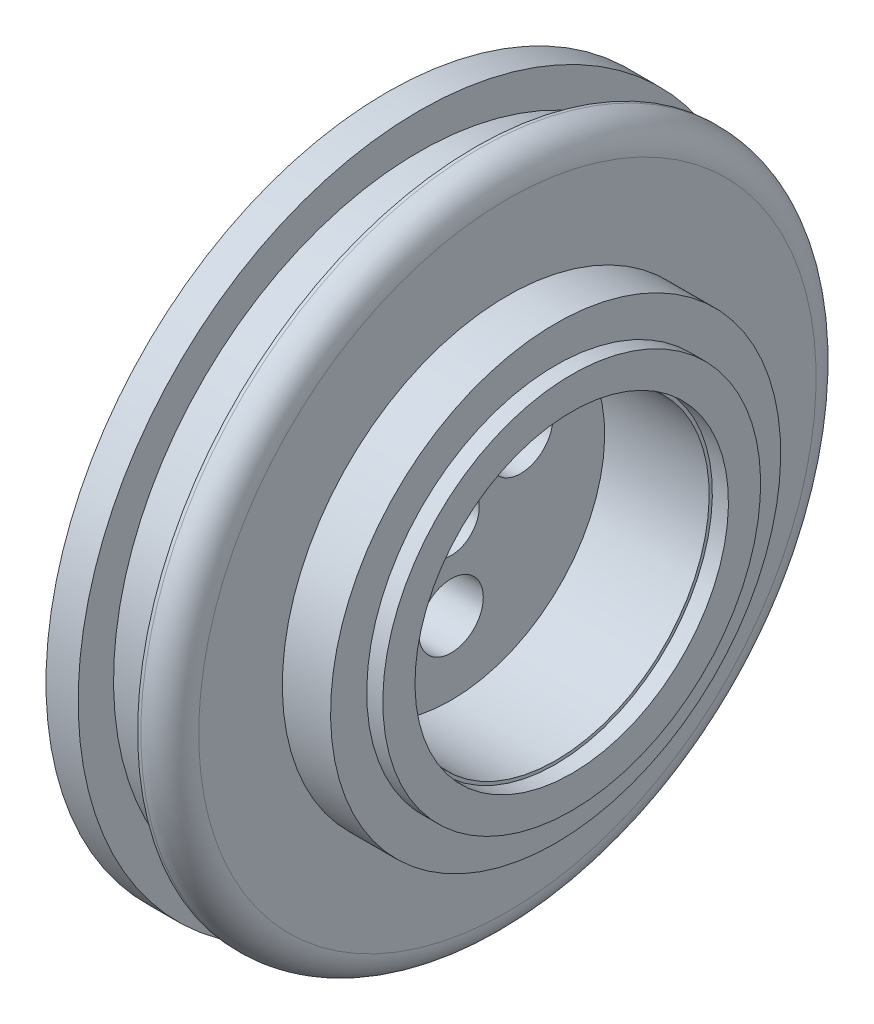
ISO-10303-21;
HEADER;
FILE_DESCRIPTION(('STEP AP214'),'2;1');
FILE_NAME('part.step','',(''),(''),'','','');
FILE_SCHEMA(('AUTOMOTIVE_DESIGN { 1 0 10303 214 1 1 1 1 }'));
ENDSEC;
DATA;
#1=APPLICATION_CONTEXT('core data for automotive mechanical design processes');
#2=APPLICATION_PROTOCOL_DEFINITION('international standard','automotive_design',2000,#1);
#3=PRODUCT_CONTEXT('',#1,'mechanical');
#4=PRODUCT('Part','Part','',(#3));
#5=PRODUCT_RELATED_PRODUCT_CATEGORY('part','',(#4));
#6=PRODUCT_DEFINITION_FORMATION('','',#4);
#7=PRODUCT_DEFINITION_CONTEXT('part definition',#1,'design');
#8=PRODUCT_DEFINITION('design','',#6,#7);
#9=PRODUCT_DEFINITION_SHAPE('','',#8);
#10=(LENGTH_UNIT() NAMED_UNIT(*) SI_UNIT(.MILLI.,.METRE.));
#11=(NAMED_UNIT(*) PLANE_ANGLE_UNIT() SI_UNIT($,.RADIAN.));
#12=(NAMED_UNIT(*) SI_UNIT($,.STERADIAN.) SOLID_ANGLE_UNIT());
#13=UNCERTAINTY_MEASURE_WITH_UNIT(LENGTH_MEASURE(1.E-05),#10,'distance_accuracy_value','');
#14=(GEOMETRIC_REPRESENTATION_CONTEXT(3) GLOBAL_UNCERTAINTY_ASSIGNED_CONTEXT((#13)) GLOBAL_UNIT_ASSIGNED_CONTEXT((#10,
#11,#12)) REPRESENTATION_CONTEXT('',''));
#15=CARTESIAN_POINT('',(0.,0.,0.));
#16=DIRECTION('',(0.,0.,1.));
#17=DIRECTION('',(1.,0.,0.));
#18=AXIS2_PLACEMENT_3D('',#15,#16,#17);
#19=CARTESIAN_POINT('',(4.00000000000001,9.55000000000001,0.));
#20=DIRECTION('',(-1.,0.,0.));
#21=DIRECTION('',(0.,-1.,0.));
#22=AXIS2_PLACEMENT_3D('',#19,#20,#21);
#23=PLANE('',#22);
#24=CARTESIAN_POINT('',(4.00000000000001,2.49999999999996,-4.33012701892222));
#25=DIRECTION('',(-1.,0.,0.));
#26=DIRECTION('',(0.,-1.,0.));
#27=AXIS2_PLACEMENT_3D('',#24,#25,#26);
#28=CIRCLE('',#27,2.);
#29=CARTESIAN_POINT('',(4.00000000000001,2.49999999999996,-6.33012701892222));
#30=VERTEX_POINT('',#29);
#31=EDGE_CURVE('E72',#30,#30,#28,.T.);
#32=ORIENTED_EDGE('',*,*,#31,.T.);
#33=EDGE_LOOP('',(#32));
#34=FACE_BOUND('',#33,.T.);
#35=CARTESIAN_POINT('',(4.00000000000001,2.50000000000002,4.33012701892218));
#36=DIRECTION('',(-1.,0.,0.));
#37=DIRECTION('',(0.,-1.,0.));
#38=AXIS2_PLACEMENT_3D('',#35,#36,#37);
#39=CIRCLE('',#38,2.);
#40=CARTESIAN_POINT('',(4.00000000000001,2.50000000000002,2.33012701892218));
#41=VERTEX_POINT('',#40);
#42=EDGE_CURVE('E61',#41,#41,#39,.T.);
#43=ORIENTED_EDGE('',*,*,#42,.T.);
#44=EDGE_LOOP('',(#43));
#45=FACE_BOUND('',#44,.T.);
#46=CARTESIAN_POINT('',(4.00000000000001,-5.,0.));
#47=DIRECTION('',(-1.,0.,0.));
#48=DIRECTION('',(0.,-1.,0.));
#49=AXIS2_PLACEMENT_3D('',#46,#47,#48);
#50=CIRCLE('',#49,2.);
#51=CARTESIAN_POINT('',(4.00000000000001,-5.,-2.));
#52=VERTEX_POINT('',#51);
#53=EDGE_CURVE('E58',#52,#52,#50,.T.);
#54=ORIENTED_EDGE('',*,*,#53,.T.);
#55=EDGE_LOOP('',(#54));
#56=FACE_BOUND('',#55,.T.);
#57=CARTESIAN_POINT('',(4.00000000000001,0.,0.));
#58=DIRECTION('',(-1.,0.,0.));
#59=DIRECTION('',(0.,-1.,0.));
#60=AXIS2_PLACEMENT_3D('',#57,#58,#59);
#61=CIRCLE('',#60,1.75);
#62=CARTESIAN_POINT('',(4.00000000000001,0.,-1.75));
#63=VERTEX_POINT('',#62);
#64=EDGE_CURVE('E55',#63,#63,#61,.T.);
#65=ORIENTED_EDGE('',*,*,#64,.T.);
#66=EDGE_LOOP('',(#65));
#67=FACE_BOUND('',#66,.T.);
#68=CARTESIAN_POINT('',(4.00000000000001,0.,0.));
#69=DIRECTION('',(-1.,0.,0.));
#70=DIRECTION('',(0.,-1.,0.));
#71=AXIS2_PLACEMENT_3D('',#68,#69,#70);
#72=CIRCLE('',#71,9.55000000000001);
#73=CARTESIAN_POINT('',(4.00000000000001,-9.55000000000001,0.));
#74=VERTEX_POINT('',#73);
#75=EDGE_CURVE('E10',#74,#74,#72,.T.);
#76=ORIENTED_EDGE('',*,*,#75,.F.);
#77=EDGE_LOOP('',(#76));
#78=FACE_BOUND('',#77,.T.);
#79=ADVANCED_FACE('F36',(#34,#45,#56,#67,#78),#23,.F.);
#80=CARTESIAN_POINT('',(0.,0.,0.));
#81=DIRECTION('',(-1.,0.,0.));
#82=DIRECTION('',(0.,-1.,0.));
#83=AXIS2_PLACEMENT_3D('',#80,#81,#82);
#84=CYLINDRICAL_SURFACE('',#83,9.55000000000001);
#85=CARTESIAN_POINT('',(10.5,0.,0.));
#86=DIRECTION('',(-1.,0.,0.));
#87=DIRECTION('',(0.,-1.,0.));
#88=AXIS2_PLACEMENT_3D('',#85,#86,#87);
#89=CIRCLE('',#88,9.55000000000001);
#90=CARTESIAN_POINT('',(10.5,-9.55000000000001,0.));
#91=VERTEX_POINT('',#90);
#92=EDGE_CURVE('E43',#91,#91,#89,.T.);
#93=ORIENTED_EDGE('',*,*,#92,.F.);
#94=EDGE_LOOP('',(#93));
#95=FACE_BOUND('',#94,.T.);
#96=ORIENTED_EDGE('',*,*,#75,.T.);
#97=EDGE_LOOP('',(#96));
#98=FACE_BOUND('',#97,.T.);
#99=ADVANCED_FACE('F118',(#95,#98),#84,.F.);
#100=CARTESIAN_POINT('',(10.5,9.75000000000001,0.));
#101=DIRECTION('',(-1.,0.,0.));
#102=DIRECTION('',(0.,-1.,0.));
#103=AXIS2_PLACEMENT_3D('',#100,#101,#102);
#104=PLANE('',#103);
#105=CARTESIAN_POINT('',(10.5,0.,0.));
#106=DIRECTION('',(-1.,0.,0.));
#107=DIRECTION('',(0.,-1.,0.));
#108=AXIS2_PLACEMENT_3D('',#105,#106,#107);
#109=CIRCLE('',#108,9.75000000000001);
#110=CARTESIAN_POINT('',(10.5,-9.75000000000001,0.));
#111=VERTEX_POINT('',#110);
#112=EDGE_CURVE('E48',#111,#111,#109,.T.);
#113=ORIENTED_EDGE('',*,*,#112,.F.);
#114=EDGE_LOOP('',(#113));
#115=FACE_BOUND('',#114,.T.);
#116=ORIENTED_EDGE('',*,*,#92,.T.);
#117=EDGE_LOOP('',(#116));
#118=FACE_BOUND('',#117,.T.);
#119=ADVANCED_FACE('F115',(#115,#118),#104,.F.);
#120=CARTESIAN_POINT('',(0.,0.,0.));
#121=DIRECTION('',(-1.,0.,0.));
#122=DIRECTION('',(0.,-1.,0.));
#123=AXIS2_PLACEMENT_3D('',#120,#121,#122);
#124=CYLINDRICAL_SURFACE('',#123,9.75000000000001);
#125=CARTESIAN_POINT('',(11.5,0.,0.));
#126=DIRECTION('',(-1.,0.,0.));
#127=DIRECTION('',(0.,-1.,0.));
#128=AXIS2_PLACEMENT_3D('',#125,#126,#127);
#129=CIRCLE('',#128,9.75000000000001);
#130=CARTESIAN_POINT('',(11.5,-9.75000000000001,0.));
#131=VERTEX_POINT('',#130);
#132=EDGE_CURVE('E108',#131,#131,#129,.T.);
#133=ORIENTED_EDGE('',*,*,#132,.F.);
#134=EDGE_LOOP('',(#133));
#135=FACE_BOUND('',#134,.T.);
#136=ORIENTED_EDGE('',*,*,#112,.T.);
#137=EDGE_LOOP('',(#136));
#138=FACE_BOUND('',#137,.T.);
#139=ADVANCED_FACE('F113',(#135,#138),#124,.F.);
#140=CARTESIAN_POINT('',(11.5,11.75,0.));
#141=DIRECTION('',(-1.,0.,0.));
#142=DIRECTION('',(0.,-1.,0.));
#143=AXIS2_PLACEMENT_3D('',#140,#141,#142);
#144=PLANE('',#143);
#145=CARTESIAN_POINT('',(11.5,0.,0.));
#146=DIRECTION('',(-1.,0.,0.));
#147=DIRECTION('',(0.,-1.,0.));
#148=AXIS2_PLACEMENT_3D('',#145,#146,#147);
#149=CIRCLE('',#148,11.75);
#150=CARTESIAN_POINT('',(11.5,-11.75,0.));
#151=VERTEX_POINT('',#150);
#152=EDGE_CURVE('E105',#151,#151,#149,.T.);
#153=ORIENTED_EDGE('',*,*,#152,.F.);
#154=EDGE_LOOP('',(#153));
#155=FACE_BOUND('',#154,.T.);
#156=ORIENTED_EDGE('',*,*,#132,.T.);
#157=EDGE_LOOP('',(#156));
#158=FACE_BOUND('',#157,.T.);
#159=ADVANCED_FACE('F130',(#155,#158),#144,.F.);
#160=CARTESIAN_POINT('',(0.,0.,0.));
#161=DIRECTION('',(-1.,0.,0.));
#162=DIRECTION('',(0.,-1.,0.));
#163=AXIS2_PLACEMENT_3D('',#160,#161,#162);
#164=CYLINDRICAL_SURFACE('',#163,11.75);
#165=CARTESIAN_POINT('',(10.5,0.,0.));
#166=DIRECTION('',(-1.,0.,0.));
#167=DIRECTION('',(0.,-1.,0.));
#168=AXIS2_PLACEMENT_3D('',#165,#166,#167);
#169=CIRCLE('',#168,11.75);
#170=CARTESIAN_POINT('',(10.5,-11.75,0.));
#171=VERTEX_POINT('',#170);
#172=EDGE_CURVE('E102',#171,#171,#169,.T.);
#173=ORIENTED_EDGE('',*,*,#172,.F.);
#174=EDGE_LOOP('',(#173));
#175=FACE_BOUND('',#174,.T.);
#176=ORIENTED_EDGE('',*,*,#152,.T.);
#177=EDGE_LOOP('',(#176));
#178=FACE_BOUND('',#177,.T.);
#179=ADVANCED_FACE('F134',(#175,#178),#164,.T.);
#180=CARTESIAN_POINT('',(10.5,14.,0.));
#181=DIRECTION('',(-1.,0.,0.));
#182=DIRECTION('',(0.,-1.,0.));
#183=AXIS2_PLACEMENT_3D('',#180,#181,#182);
#184=PLANE('',#183);
#185=CARTESIAN_POINT('',(10.5,0.,0.));
#186=DIRECTION('',(-1.,0.,0.));
#187=DIRECTION('',(0.,-1.,0.));
#188=AXIS2_PLACEMENT_3D('',#185,#186,#187);
#189=CIRCLE('',#188,14.);
#190=CARTESIAN_POINT('',(10.5,-14.,0.));
#191=VERTEX_POINT('',#190);
#192=EDGE_CURVE('E99',#191,#191,#189,.T.);
#193=ORIENTED_EDGE('',*,*,#192,.F.);
#194=EDGE_LOOP('',(#193));
#195=FACE_BOUND('',#194,.T.);
#196=ORIENTED_EDGE('',*,*,#172,.T.);
#197=EDGE_LOOP('',(#196));
#198=FACE_BOUND('',#197,.T.);
#199=ADVANCED_FACE('F138',(#195,#198),#184,.F.);
#200=CARTESIAN_POINT('',(0.,0.,0.));
#201=DIRECTION('',(-1.,0.,0.));
#202=DIRECTION('',(0.,-1.,0.));
#203=AXIS2_PLACEMENT_3D('',#200,#201,#202);
#204=CYLINDRICAL_SURFACE('',#203,14.);
#205=CARTESIAN_POINT('',(7.5,0.,0.));
#206=DIRECTION('',(-1.,0.,0.));
#207=DIRECTION('',(0.,-1.,0.));
#208=AXIS2_PLACEMENT_3D('',#205,#206,#207);
#209=CIRCLE('',#208,14.);
#210=CARTESIAN_POINT('',(7.5,-14.,0.));
#211=VERTEX_POINT('',#210);
#212=EDGE_CURVE('E96',#211,#211,#209,.T.);
#213=ORIENTED_EDGE('',*,*,#212,.F.);
#214=EDGE_LOOP('',(#213));
#215=FACE_BOUND('',#214,.T.);
#216=ORIENTED_EDGE('',*,*,#192,.T.);
#217=EDGE_LOOP('',(#216));
#218=FACE_BOUND('',#217,.T.);
#219=ADVANCED_FACE('F142',(#215,#218),#204,.T.);
#220=CARTESIAN_POINT('',(7.5,14.,0.));
#221=DIRECTION('',(-1.,0.,0.));
#222=DIRECTION('',(0.,-1.,0.));
#223=AXIS2_PLACEMENT_3D('',#220,#221,#222);
#224=PLANE('',#223);
#225=CARTESIAN_POINT('',(7.49999999999999,0.,0.));
#226=DIRECTION('',(-1.,0.,0.));
#227=DIRECTION('',(0.,-1.,0.));
#228=AXIS2_PLACEMENT_3D('',#225,#226,#227);
#229=CIRCLE('',#228,19.2);
#230=CARTESIAN_POINT('',(7.49999999999999,-19.2,0.));
#231=VERTEX_POINT('',#230);
#232=EDGE_CURVE('E93',#231,#231,#229,.T.);
#233=ORIENTED_EDGE('',*,*,#232,.F.);
#234=EDGE_LOOP('',(#233));
#235=FACE_BOUND('',#234,.T.);
#236=ORIENTED_EDGE('',*,*,#212,.T.);
#237=EDGE_LOOP('',(#236));
#238=FACE_BOUND('',#237,.T.);
#239=ADVANCED_FACE('F146',(#235,#238),#224,.F.);
#240=CARTESIAN_POINT('',(5.69999999999999,0.,0.));
#241=DIRECTION('',(-1.,0.,0.));
#242=DIRECTION('',(0.,-1.,0.));
#243=AXIS2_PLACEMENT_3D('',#240,#241,#242);
#244=TOROIDAL_SURFACE('',#243,19.2,1.8);
#245=CARTESIAN_POINT('',(5.69999999999999,0.,0.));
#246=DIRECTION('',(-1.,0.,0.));
#247=DIRECTION('',(0.,-1.,0.));
#248=AXIS2_PLACEMENT_3D('',#245,#246,#247);
#249=CIRCLE('',#248,21.);
#250=CARTESIAN_POINT('',(5.69999999999999,-21.,0.));
#251=VERTEX_POINT('',#250);
#252=EDGE_CURVE('E90',#251,#251,#249,.T.);
#253=ORIENTED_EDGE('',*,*,#252,.F.);
#254=EDGE_LOOP('',(#253));
#255=FACE_BOUND('',#254,.T.);
#256=ORIENTED_EDGE('',*,*,#232,.T.);
#257=EDGE_LOOP('',(#256));
#258=FACE_BOUND('',#257,.T.);
#259=ADVANCED_FACE('F150',(#255,#258),#244,.T.);
#260=CARTESIAN_POINT('',(0.,0.,0.));
#261=DIRECTION('',(-1.,0.,0.));
#262=DIRECTION('',(0.,-1.,0.));
#263=AXIS2_PLACEMENT_3D('',#260,#261,#262);
#264=CYLINDRICAL_SURFACE('',#263,21.);
#265=CARTESIAN_POINT('',(5.49999999999999,0.,0.));
#266=DIRECTION('',(-1.,0.,0.));
#267=DIRECTION('',(0.,-1.,0.));
#268=AXIS2_PLACEMENT_3D('',#265,#266,#267);
#269=CIRCLE('',#268,21.);
#270=CARTESIAN_POINT('',(5.49999999999999,-21.,0.));
#271=VERTEX_POINT('',#270);
#272=EDGE_CURVE('E87',#271,#271,#269,.T.);
#273=ORIENTED_EDGE('',*,*,#272,.F.);
#274=EDGE_LOOP('',(#273));
#275=FACE_BOUND('',#274,.T.);
#276=ORIENTED_EDGE('',*,*,#252,.T.);
#277=EDGE_LOOP('',(#276));
#278=FACE_BOUND('',#277,.T.);
#279=ADVANCED_FACE('F154',(#275,#278),#264,.T.);
#280=CARTESIAN_POINT('',(5.49999999999999,21.,0.));
#281=DIRECTION('',(1.,0.,0.));
#282=DIRECTION('',(0.,1.,0.));
#283=AXIS2_PLACEMENT_3D('',#280,#281,#282);
#284=PLANE('',#283);
#285=CARTESIAN_POINT('',(5.49999999999999,0.,0.));
#286=DIRECTION('',(-1.,0.,0.));
#287=DIRECTION('',(0.,-1.,0.));
#288=AXIS2_PLACEMENT_3D('',#285,#286,#287);
#289=CIRCLE('',#288,19.);
#290=CARTESIAN_POINT('',(5.49999999999999,-19.,0.));
#291=VERTEX_POINT('',#290);
#292=EDGE_CURVE('E84',#291,#291,#289,.T.);
#293=ORIENTED_EDGE('',*,*,#292,.F.);
#294=EDGE_LOOP('',(#293));
#295=FACE_BOUND('',#294,.T.);
#296=ORIENTED_EDGE('',*,*,#272,.T.);
#297=EDGE_LOOP('',(#296));
#298=FACE_BOUND('',#297,.T.);
#299=ADVANCED_FACE('F158',(#295,#298),#284,.F.);
#300=CARTESIAN_POINT('',(0.,0.,0.));
#301=DIRECTION('',(-1.,0.,0.));
#302=DIRECTION('',(0.,-1.,0.));
#303=AXIS2_PLACEMENT_3D('',#300,#301,#302);
#304=CYLINDRICAL_SURFACE('',#303,19.);
#305=CARTESIAN_POINT('',(1.99999999999999,0.,0.));
#306=DIRECTION('',(-1.,0.,0.));
#307=DIRECTION('',(0.,-1.,0.));
#308=AXIS2_PLACEMENT_3D('',#305,#306,#307);
#309=CIRCLE('',#308,19.);
#310=CARTESIAN_POINT('',(1.99999999999999,-19.,0.));
#311=VERTEX_POINT('',#310);
#312=EDGE_CURVE('E81',#311,#311,#309,.T.);
#313=ORIENTED_EDGE('',*,*,#312,.F.);
#314=EDGE_LOOP('',(#313));
#315=FACE_BOUND('',#314,.T.);
#316=ORIENTED_EDGE('',*,*,#292,.T.);
#317=EDGE_LOOP('',(#316));
#318=FACE_BOUND('',#317,.T.);
#319=ADVANCED_FACE('F162',(#315,#318),#304,.T.);
#320=CARTESIAN_POINT('',(1.99999999999999,19.,0.));
#321=DIRECTION('',(-1.,0.,0.));
#322=DIRECTION('',(0.,-1.,0.));
#323=AXIS2_PLACEMENT_3D('',#320,#321,#322);
#324=PLANE('',#323);
#325=CARTESIAN_POINT('',(1.99999999999999,0.,0.));
#326=DIRECTION('',(-1.,0.,0.));
#327=DIRECTION('',(0.,-1.,0.));
#328=AXIS2_PLACEMENT_3D('',#325,#326,#327);
#329=CIRCLE('',#328,21.2);
#330=CARTESIAN_POINT('',(1.99999999999999,-21.2,0.));
#331=VERTEX_POINT('',#330);
#332=EDGE_CURVE('E78',#331,#331,#329,.T.);
#333=ORIENTED_EDGE('',*,*,#332,.F.);
#334=EDGE_LOOP('',(#333));
#335=FACE_BOUND('',#334,.T.);
#336=ORIENTED_EDGE('',*,*,#312,.T.);
#337=EDGE_LOOP('',(#336));
#338=FACE_BOUND('',#337,.T.);
#339=ADVANCED_FACE('F166',(#335,#338),#324,.F.);
#340=CARTESIAN_POINT('',(0.,0.,0.));
#341=DIRECTION('',(-1.,0.,0.));
#342=DIRECTION('',(0.,-1.,0.));
#343=AXIS2_PLACEMENT_3D('',#340,#341,#342);
#344=CYLINDRICAL_SURFACE('',#343,21.2);
#345=CARTESIAN_POINT('',(0.,0.,0.));
#346=DIRECTION('',(-1.,0.,0.));
#347=DIRECTION('',(0.,-1.,0.));
#348=AXIS2_PLACEMENT_3D('',#345,#346,#347);
#349=CIRCLE('',#348,21.2);
#350=CARTESIAN_POINT('',(0.,-21.2,0.));
#351=VERTEX_POINT('',#350);
#352=EDGE_CURVE('E75',#351,#351,#349,.T.);
#353=ORIENTED_EDGE('',*,*,#352,.F.);
#354=EDGE_LOOP('',(#353));
#355=FACE_BOUND('',#354,.T.);
#356=ORIENTED_EDGE('',*,*,#332,.T.);
#357=EDGE_LOOP('',(#356));
#358=FACE_BOUND('',#357,.T.);
#359=ADVANCED_FACE('F170',(#355,#358),#344,.T.);
#360=CARTESIAN_POINT('',(0.,21.2,0.));
#361=DIRECTION('',(1.,0.,0.));
#362=DIRECTION('',(0.,1.,0.));
#363=AXIS2_PLACEMENT_3D('',#360,#361,#362);
#364=PLANE('',#363);
#365=CARTESIAN_POINT('',(0.,2.49999999999996,-4.33012701892222));
#366=DIRECTION('',(1.,0.,0.));
#367=DIRECTION('',(0.,1.,0.));
#368=AXIS2_PLACEMENT_3D('',#365,#366,#367);
#369=CIRCLE('',#368,2.);
#370=CARTESIAN_POINT('',(0.,2.49999999999996,-6.33012701892222));
#371=VERTEX_POINT('',#370);
#372=EDGE_CURVE('E39',#371,#371,#369,.T.);
#373=ORIENTED_EDGE('',*,*,#372,.T.);
#374=EDGE_LOOP('',(#373));
#375=FACE_BOUND('',#374,.T.);
#376=CARTESIAN_POINT('',(0.,2.50000000000002,4.33012701892218));
#377=DIRECTION('',(1.,0.,0.));
#378=DIRECTION('',(0.,1.,0.));
#379=AXIS2_PLACEMENT_3D('',#376,#377,#378);
#380=CIRCLE('',#379,2.);
#381=CARTESIAN_POINT('',(0.,2.50000000000002,2.33012701892218));
#382=VERTEX_POINT('',#381);
#383=EDGE_CURVE('E59',#382,#382,#380,.T.);
#384=ORIENTED_EDGE('',*,*,#383,.T.);
#385=EDGE_LOOP('',(#384));
#386=FACE_BOUND('',#385,.T.);
#387=CARTESIAN_POINT('',(0.,-5.,0.));
#388=DIRECTION('',(1.,0.,0.));
#389=DIRECTION('',(0.,1.,0.));
#390=AXIS2_PLACEMENT_3D('',#387,#388,#389);
#391=CIRCLE('',#390,2.);
#392=CARTESIAN_POINT('',(0.,-5.,-2.));
#393=VERTEX_POINT('',#392);
#394=EDGE_CURVE('E56',#393,#393,#391,.T.);
#395=ORIENTED_EDGE('',*,*,#394,.T.);
#396=EDGE_LOOP('',(#395));
#397=FACE_BOUND('',#396,.T.);
#398=CARTESIAN_POINT('',(0.,0.,0.));
#399=DIRECTION('',(1.,0.,0.));
#400=DIRECTION('',(0.,1.,0.));
#401=AXIS2_PLACEMENT_3D('',#398,#399,#400);
#402=CIRCLE('',#401,1.75);
#403=CARTESIAN_POINT('',(0.,0.,-1.75));
#404=VERTEX_POINT('',#403);
#405=EDGE_CURVE('E52',#404,#404,#402,.T.);
#406=ORIENTED_EDGE('',*,*,#405,.T.);
#407=EDGE_LOOP('',(#406));
#408=FACE_BOUND('',#407,.T.);
#409=ORIENTED_EDGE('',*,*,#352,.T.);
#410=EDGE_LOOP('',(#409));
#411=FACE_BOUND('',#410,.T.);
#412=ADVANCED_FACE('F174',(#375,#386,#397,#408,#411),#364,.F.);
#413=CARTESIAN_POINT('',(-1.2E-05,0.,0.));
#414=DIRECTION('',(1.,0.,0.));
#415=DIRECTION('',(0.,0.,-1.));
#416=AXIS2_PLACEMENT_3D('',#413,#414,#415);
#417=CYLINDRICAL_SURFACE('',#416,1.75);
#418=CARTESIAN_POINT('',(0.,0.,-1.75));
#419=CARTESIAN_POINT('',(0.0416666666666615,0.,-1.75));
#420=CARTESIAN_POINT('',(0.0833333333333283,0.,-1.75));
#421=CARTESIAN_POINT('',(0.166666666666662,0.,-1.75));
#422=CARTESIAN_POINT('',(0.208333333333329,0.,-1.75));
#423=CARTESIAN_POINT('',(0.291666666666662,0.,-1.75));
#424=CARTESIAN_POINT('',(0.333333333333329,0.,-1.75));
#425=CARTESIAN_POINT('',(0.416666666666663,0.,-1.75));
#426=CARTESIAN_POINT('',(0.45833333333333,0.,-1.75));
#427=CARTESIAN_POINT('',(0.541666666666663,0.,-1.75));
#428=CARTESIAN_POINT('',(0.58333333333333,0.,-1.75));
#429=CARTESIAN_POINT('',(0.666666666666664,0.,-1.75));
#430=CARTESIAN_POINT('',(0.708333333333331,0.,-1.75));
#431=CARTESIAN_POINT('',(0.791666666666664,0.,-1.75));
#432=CARTESIAN_POINT('',(0.833333333333331,0.,-1.75));
#433=CARTESIAN_POINT('',(0.916666666666665,0.,-1.75));
#434=CARTESIAN_POINT('',(0.958333333333331,0.,-1.75));
#435=CARTESIAN_POINT('',(1.04166666666667,0.,-1.75));
#436=CARTESIAN_POINT('',(1.08333333333333,0.,-1.75));
#437=CARTESIAN_POINT('',(1.16666666666667,0.,-1.75));
#438=CARTESIAN_POINT('',(1.20833333333333,0.,-1.75));
#439=CARTESIAN_POINT('',(1.29166666666667,0.,-1.75));
#440=CARTESIAN_POINT('',(1.33333333333333,0.,-1.75));
#441=CARTESIAN_POINT('',(1.41666666666667,0.,-1.75));
#442=CARTESIAN_POINT('',(1.45833333333333,0.,-1.75));
#443=CARTESIAN_POINT('',(1.54166666666667,0.,-1.75));
#444=CARTESIAN_POINT('',(1.58333333333333,0.,-1.75));
#445=CARTESIAN_POINT('',(1.66666666666667,0.,-1.75));
#446=CARTESIAN_POINT('',(1.70833333333333,0.,-1.75));
#447=CARTESIAN_POINT('',(1.79166666666667,0.,-1.75));
#448=CARTESIAN_POINT('',(1.83333333333333,0.,-1.75));
#449=CARTESIAN_POINT('',(1.91666666666667,0.,-1.75));
#450=CARTESIAN_POINT('',(1.95833333333333,0.,-1.75));
#451=CARTESIAN_POINT('',(2.04166666666667,0.,-1.75));
#452=CARTESIAN_POINT('',(2.08333333333334,0.,-1.75));
#453=CARTESIAN_POINT('',(2.16666666666667,0.,-1.75));
#454=CARTESIAN_POINT('',(2.20833333333334,0.,-1.75));
#455=CARTESIAN_POINT('',(2.29166666666667,0.,-1.75));
#456=CARTESIAN_POINT('',(2.33333333333334,0.,-1.75));
#457=CARTESIAN_POINT('',(2.41666666666667,0.,-1.75));
#458=CARTESIAN_POINT('',(2.45833333333334,0.,-1.75));
#459=CARTESIAN_POINT('',(2.54166666666667,0.,-1.75));
#460=CARTESIAN_POINT('',(2.58333333333334,0.,-1.75));
#461=CARTESIAN_POINT('',(2.66666666666667,0.,-1.75));
#462=CARTESIAN_POINT('',(2.70833333333334,0.,-1.75));
#463=CARTESIAN_POINT('',(2.79166666666667,0.,-1.75));
#464=CARTESIAN_POINT('',(2.83333333333334,0.,-1.75));
#465=CARTESIAN_POINT('',(2.91666666666667,0.,-1.75));
#466=CARTESIAN_POINT('',(2.95833333333334,0.,-1.75));
#467=CARTESIAN_POINT('',(3.04166666666667,0.,-1.75));
#468=CARTESIAN_POINT('',(3.08333333333334,0.,-1.75));
#469=CARTESIAN_POINT('',(3.16666666666667,0.,-1.75));
#470=CARTESIAN_POINT('',(3.20833333333334,0.,-1.75));
#471=CARTESIAN_POINT('',(3.29166666666667,0.,-1.75));
#472=CARTESIAN_POINT('',(3.33333333333334,0.,-1.75));
#473=CARTESIAN_POINT('',(3.41666666666667,0.,-1.75));
#474=CARTESIAN_POINT('',(3.45833333333334,0.,-1.75));
#475=CARTESIAN_POINT('',(3.54166666666667,0.,-1.75));
#476=CARTESIAN_POINT('',(3.58333333333334,0.,-1.75));
#477=CARTESIAN_POINT('',(3.66666666666667,0.,-1.75));
#478=CARTESIAN_POINT('',(3.70833333333334,0.,-1.75));
#479=CARTESIAN_POINT('',(3.79166666666667,0.,-1.75));
#480=CARTESIAN_POINT('',(3.83333333333334,0.,-1.75));
#481=CARTESIAN_POINT('',(3.91666666666667,0.,-1.75));
#482=CARTESIAN_POINT('',(3.95833333333334,0.,-1.75));
#483=CARTESIAN_POINT('',(4.00000000000001,0.,-1.75));
#484=B_SPLINE_CURVE_WITH_KNOTS('',3,(#418,#419,#420,#421,#422,#423,#424,#425,#426,#427,#428,
#429,#430,#431,#432,#433,#434,#435,#436,#437,#438,#439,#440,#441,#442,#443,#444,#445,#446,#447,
#448,#449,#450,#451,#452,#453,#454,#455,#456,#457,#458,#459,#460,#461,#462,#463,#464,#465,#466,
#467,#468,#469,#470,#471,#472,#473,#474,#475,#476,#477,#478,#479,#480,#481,#482,#483),
.UNSPECIFIED.,.F.,.F.,(4,2,2,2,2,2,2,2,2,2,2,2,2,2,2,2,2,2,2,2,2,2,2,2,2,2,2,2,2,2,2,2,4),(0.,
0.125,0.250000000000001,0.375000000000001,0.500000000000002,0.625000000000002,0.750000000000003,
0.875000000000003,1.,1.125,1.25,1.375,1.50000000000001,1.62500000000001,1.75000000000001,
1.87500000000001,2.00000000000001,2.12500000000001,2.25000000000001,2.37500000000001,
2.50000000000001,2.62500000000001,2.75000000000001,2.87500000000001,3.00000000000001,
3.12500000000001,3.25000000000001,3.37500000000001,3.50000000000001,3.62500000000001,
3.75000000000001,3.87500000000001,4.00000000000001),.UNSPECIFIED.);
#485=EDGE_CURVE('BSEAM178',#404,#63,#484,.T.);
#486=ORIENTED_EDGE('',*,*,#405,.F.);
#487=ORIENTED_EDGE('',*,*,#64,.F.);
#488=ORIENTED_EDGE('',*,*,#485,.T.);
#489=ORIENTED_EDGE('',*,*,#485,.F.);
#490=EDGE_LOOP('',(#486,#488,#487,#489));
#491=FACE_BOUND('',#490,.T.);
#492=ADVANCED_FACE('F178',(#491),#417,.F.);
#493=CARTESIAN_POINT('',(-1.2E-05,-5.,0.));
#494=DIRECTION('',(1.,0.,0.));
#495=DIRECTION('',(0.,0.,-1.));
#496=AXIS2_PLACEMENT_3D('',#493,#494,#495);
#497=CYLINDRICAL_SURFACE('',#496,2.);
#498=CARTESIAN_POINT('',(0.,-5.,-2.));
#499=CARTESIAN_POINT('',(0.0416666666666615,-5.,-2.));
#500=CARTESIAN_POINT('',(0.0833333333333283,-5.,-2.));
#501=CARTESIAN_POINT('',(0.166666666666662,-5.,-2.));
#502=CARTESIAN_POINT('',(0.208333333333329,-5.,-2.));
#503=CARTESIAN_POINT('',(0.291666666666662,-5.,-2.));
#504=CARTESIAN_POINT('',(0.333333333333329,-5.,-2.));
#505=CARTESIAN_POINT('',(0.416666666666663,-5.,-2.));
#506=CARTESIAN_POINT('',(0.45833333333333,-5.,-2.));
#507=CARTESIAN_POINT('',(0.541666666666663,-5.,-2.));
#508=CARTESIAN_POINT('',(0.58333333333333,-5.,-2.));
#509=CARTESIAN_POINT('',(0.666666666666664,-5.,-2.));
#510=CARTESIAN_POINT('',(0.708333333333331,-5.,-2.));
#511=CARTESIAN_POINT('',(0.791666666666664,-5.,-2.));
#512=CARTESIAN_POINT('',(0.833333333333331,-5.,-2.));
#513=CARTESIAN_POINT('',(0.916666666666665,-5.,-2.));
#514=CARTESIAN_POINT('',(0.958333333333331,-5.,-2.));
#515=CARTESIAN_POINT('',(1.04166666666667,-5.,-2.));
#516=CARTESIAN_POINT('',(1.08333333333333,-5.,-2.));
#517=CARTESIAN_POINT('',(1.16666666666667,-5.,-2.));
#518=CARTESIAN_POINT('',(1.20833333333333,-5.,-2.));
#519=CARTESIAN_POINT('',(1.29166666666667,-5.,-2.));
#520=CARTESIAN_POINT('',(1.33333333333333,-5.,-2.));
#521=CARTESIAN_POINT('',(1.41666666666667,-5.,-2.));
#522=CARTESIAN_POINT('',(1.45833333333333,-5.,-2.));
#523=CARTESIAN_POINT('',(1.54166666666667,-5.,-2.));
#524=CARTESIAN_POINT('',(1.58333333333333,-5.,-2.));
#525=CARTESIAN_POINT('',(1.66666666666667,-5.,-2.));
#526=CARTESIAN_POINT('',(1.70833333333333,-5.,-2.));
#527=CARTESIAN_POINT('',(1.79166666666667,-5.,-2.));
#528=CARTESIAN_POINT('',(1.83333333333333,-5.,-2.));
#529=CARTESIAN_POINT('',(1.91666666666667,-5.,-2.));
#530=CARTESIAN_POINT('',(1.95833333333333,-5.,-2.));
#531=CARTESIAN_POINT('',(2.04166666666667,-5.,-2.));
#532=CARTESIAN_POINT('',(2.08333333333334,-5.,-2.));
#533=CARTESIAN_POINT('',(2.16666666666667,-5.,-2.));
#534=CARTESIAN_POINT('',(2.20833333333334,-5.,-2.));
#535=CARTESIAN_POINT('',(2.29166666666667,-5.,-2.));
#536=CARTESIAN_POINT('',(2.33333333333334,-5.,-2.));
#537=CARTESIAN_POINT('',(2.41666666666667,-5.,-2.));
#538=CARTESIAN_POINT('',(2.45833333333334,-5.,-2.));
#539=CARTESIAN_POINT('',(2.54166666666667,-5.,-2.));
#540=CARTESIAN_POINT('',(2.58333333333334,-5.,-2.));
#541=CARTESIAN_POINT('',(2.66666666666667,-5.,-2.));
#542=CARTESIAN_POINT('',(2.70833333333334,-5.,-2.));
#543=CARTESIAN_POINT('',(2.79166666666667,-5.,-2.));
#544=CARTESIAN_POINT('',(2.83333333333334,-5.,-2.));
#545=CARTESIAN_POINT('',(2.91666666666667,-5.,-2.));
#546=CARTESIAN_POINT('',(2.95833333333334,-5.,-2.));
#547=CARTESIAN_POINT('',(3.04166666666667,-5.,-2.));
#548=CARTESIAN_POINT('',(3.08333333333334,-5.,-2.));
#549=CARTESIAN_POINT('',(3.16666666666667,-5.,-2.));
#550=CARTESIAN_POINT('',(3.20833333333334,-5.,-2.));
#551=CARTESIAN_POINT('',(3.29166666666667,-5.,-2.));
#552=CARTESIAN_POINT('',(3.33333333333334,-5.,-2.));
#553=CARTESIAN_POINT('',(3.41666666666667,-5.,-2.));
#554=CARTESIAN_POINT('',(3.45833333333334,-5.,-2.));
#555=CARTESIAN_POINT('',(3.54166666666667,-5.,-2.));
#556=CARTESIAN_POINT('',(3.58333333333334,-5.,-2.));
#557=CARTESIAN_POINT('',(3.66666666666667,-5.,-2.));
#558=CARTESIAN_POINT('',(3.70833333333334,-5.,-2.));
#559=CARTESIAN_POINT('',(3.79166666666667,-5.,-2.));
#560=CARTESIAN_POINT('',(3.83333333333334,-5.,-2.));
#561=CARTESIAN_POINT('',(3.91666666666667,-5.,-2.));
#562=CARTESIAN_POINT('',(3.95833333333334,-5.,-2.));
#563=CARTESIAN_POINT('',(4.00000000000001,-5.,-2.));
#564=B_SPLINE_CURVE_WITH_KNOTS('',3,(#498,#499,#500,#501,#502,#503,#504,#505,#506,#507,#508,
#509,#510,#511,#512,#513,#514,#515,#516,#517,#518,#519,#520,#521,#522,#523,#524,#525,#526,#527,
#528,#529,#530,#531,#532,#533,#534,#535,#536,#537,#538,#539,#540,#541,#542,#543,#544,#545,#546,
#547,#548,#549,#550,#551,#552,#553,#554,#555,#556,#557,#558,#559,#560,#561,#562,#563),
.UNSPECIFIED.,.F.,.F.,(4,2,2,2,2,2,2,2,2,2,2,2,2,2,2,2,2,2,2,2,2,2,2,2,2,2,2,2,2,2,2,2,4),(0.,
0.125,0.250000000000001,0.375000000000001,0.500000000000002,0.625000000000002,0.750000000000003,
0.875000000000003,1.,1.125,1.25,1.375,1.50000000000001,1.62500000000001,1.75000000000001,
1.87500000000001,2.00000000000001,2.12500000000001,2.25000000000001,2.37500000000001,
2.50000000000001,2.62500000000001,2.75000000000001,2.87500000000001,3.00000000000001,
3.12500000000001,3.25000000000001,3.37500000000001,3.50000000000001,3.62500000000001,
3.75000000000001,3.87500000000001,4.00000000000001),.UNSPECIFIED.);
#565=EDGE_CURVE('BSEAM182',#393,#52,#564,.T.);
#566=ORIENTED_EDGE('',*,*,#394,.F.);
#567=ORIENTED_EDGE('',*,*,#53,.F.);
#568=ORIENTED_EDGE('',*,*,#565,.T.);
#569=ORIENTED_EDGE('',*,*,#565,.F.);
#570=EDGE_LOOP('',(#566,#568,#567,#569));
#571=FACE_BOUND('',#570,.T.);
#572=ADVANCED_FACE('F182',(#571),#497,.F.);
#573=CARTESIAN_POINT('',(-1.2E-05,2.50000000000002,4.33012701892218));
#574=DIRECTION('',(1.,0.,0.));
#575=DIRECTION('',(0.,0.,-1.));
#576=AXIS2_PLACEMENT_3D('',#573,#574,#575);
#577=CYLINDRICAL_SURFACE('',#576,2.);
#578=CARTESIAN_POINT('',(0.,2.50000000000002,2.33012701892218));
#579=CARTESIAN_POINT('',(0.0416666666666615,2.50000000000002,2.33012701892218));
#580=CARTESIAN_POINT('',(0.0833333333333283,2.50000000000002,2.33012701892218));
#581=CARTESIAN_POINT('',(0.166666666666662,2.50000000000002,2.33012701892218));
#582=CARTESIAN_POINT('',(0.208333333333329,2.50000000000002,2.33012701892218));
#583=CARTESIAN_POINT('',(0.291666666666662,2.50000000000002,2.33012701892218));
#584=CARTESIAN_POINT('',(0.333333333333329,2.50000000000002,2.33012701892218));
#585=CARTESIAN_POINT('',(0.416666666666663,2.50000000000002,2.33012701892218));
#586=CARTESIAN_POINT('',(0.45833333333333,2.50000000000002,2.33012701892218));
#587=CARTESIAN_POINT('',(0.541666666666663,2.50000000000002,2.33012701892218));
#588=CARTESIAN_POINT('',(0.58333333333333,2.50000000000002,2.33012701892218));
#589=CARTESIAN_POINT('',(0.666666666666664,2.50000000000002,2.33012701892218));
#590=CARTESIAN_POINT('',(0.708333333333331,2.50000000000002,2.33012701892218));
#591=CARTESIAN_POINT('',(0.791666666666664,2.50000000000002,2.33012701892218));
#592=CARTESIAN_POINT('',(0.833333333333331,2.50000000000002,2.33012701892218));
#593=CARTESIAN_POINT('',(0.916666666666665,2.50000000000002,2.33012701892218));
#594=CARTESIAN_POINT('',(0.958333333333331,2.50000000000002,2.33012701892218));
#595=CARTESIAN_POINT('',(1.04166666666667,2.50000000000002,2.33012701892218));
#596=CARTESIAN_POINT('',(1.08333333333333,2.50000000000002,2.33012701892218));
#597=CARTESIAN_POINT('',(1.16666666666667,2.50000000000002,2.33012701892218));
#598=CARTESIAN_POINT('',(1.20833333333333,2.50000000000002,2.33012701892218));
#599=CARTESIAN_POINT('',(1.29166666666667,2.50000000000002,2.33012701892218));
#600=CARTESIAN_POINT('',(1.33333333333333,2.50000000000002,2.33012701892218));
#601=CARTESIAN_POINT('',(1.41666666666667,2.50000000000002,2.33012701892218));
#602=CARTESIAN_POINT('',(1.45833333333333,2.50000000000002,2.33012701892218));
#603=CARTESIAN_POINT('',(1.54166666666667,2.50000000000002,2.33012701892218));
#604=CARTESIAN_POINT('',(1.58333333333333,2.50000000000002,2.33012701892218));
#605=CARTESIAN_POINT('',(1.66666666666667,2.50000000000002,2.33012701892218));
#606=CARTESIAN_POINT('',(1.70833333333333,2.50000000000002,2.33012701892218));
#607=CARTESIAN_POINT('',(1.79166666666667,2.50000000000002,2.33012701892218));
#608=CARTESIAN_POINT('',(1.83333333333333,2.50000000000002,2.33012701892218));
#609=CARTESIAN_POINT('',(1.91666666666667,2.50000000000002,2.33012701892218));
#610=CARTESIAN_POINT('',(1.95833333333333,2.50000000000002,2.33012701892218));
#611=CARTESIAN_POINT('',(2.04166666666667,2.50000000000002,2.33012701892218));
#612=CARTESIAN_POINT('',(2.08333333333334,2.50000000000002,2.33012701892218));
#613=CARTESIAN_POINT('',(2.16666666666667,2.50000000000002,2.33012701892218));
#614=CARTESIAN_POINT('',(2.20833333333334,2.50000000000002,2.33012701892218));
#615=CARTESIAN_POINT('',(2.29166666666667,2.50000000000002,2.33012701892218));
#616=CARTESIAN_POINT('',(2.33333333333334,2.50000000000002,2.33012701892218));
#617=CARTESIAN_POINT('',(2.41666666666667,2.50000000000002,2.33012701892218));
#618=CARTESIAN_POINT('',(2.45833333333334,2.50000000000002,2.33012701892218));
#619=CARTESIAN_POINT('',(2.54166666666667,2.50000000000002,2.33012701892218));
#620=CARTESIAN_POINT('',(2.58333333333334,2.50000000000002,2.33012701892218));
#621=CARTESIAN_POINT('',(2.66666666666667,2.50000000000002,2.33012701892218));
#622=CARTESIAN_POINT('',(2.70833333333334,2.50000000000002,2.33012701892218));
#623=CARTESIAN_POINT('',(2.79166666666667,2.50000000000002,2.33012701892218));
#624=CARTESIAN_POINT('',(2.83333333333334,2.50000000000002,2.33012701892218));
#625=CARTESIAN_POINT('',(2.91666666666667,2.50000000000002,2.33012701892218));
#626=CARTESIAN_POINT('',(2.95833333333334,2.50000000000002,2.33012701892218));
#627=CARTESIAN_POINT('',(3.04166666666667,2.50000000000002,2.33012701892218));
#628=CARTESIAN_POINT('',(3.08333333333334,2.50000000000002,2.33012701892218));
#629=CARTESIAN_POINT('',(3.16666666666667,2.50000000000002,2.33012701892218));
#630=CARTESIAN_POINT('',(3.20833333333334,2.50000000000002,2.33012701892218));
#631=CARTESIAN_POINT('',(3.29166666666667,2.50000000000002,2.33012701892218));
#632=CARTESIAN_POINT('',(3.33333333333334,2.50000000000002,2.33012701892218));
#633=CARTESIAN_POINT('',(3.41666666666667,2.50000000000002,2.33012701892218));
#634=CARTESIAN_POINT('',(3.45833333333334,2.50000000000002,2.33012701892218));
#635=CARTESIAN_POINT('',(3.54166666666667,2.50000000000002,2.33012701892218));
#636=CARTESIAN_POINT('',(3.58333333333334,2.50000000000002,2.33012701892218));
#637=CARTESIAN_POINT('',(3.66666666666667,2.50000000000002,2.33012701892218));
#638=CARTESIAN_POINT('',(3.70833333333334,2.50000000000002,2.33012701892218));
#639=CARTESIAN_POINT('',(3.79166666666667,2.50000000000002,2.33012701892218));
#640=CARTESIAN_POINT('',(3.83333333333334,2.50000000000002,2.33012701892218));
#641=CARTESIAN_POINT('',(3.91666666666667,2.50000000000002,2.33012701892218));
#642=CARTESIAN_POINT('',(3.95833333333334,2.50000000000002,2.33012701892218));
#643=CARTESIAN_POINT('',(4.00000000000001,2.50000000000002,2.33012701892218));
#644=B_SPLINE_CURVE_WITH_KNOTS('',3,(#578,#579,#580,#581,#582,#583,#584,#585,#586,#587,#588,
#589,#590,#591,#592,#593,#594,#595,#596,#597,#598,#599,#600,#601,#602,#603,#604,#605,#606,#607,
#608,#609,#610,#611,#612,#613,#614,#615,#616,#617,#618,#619,#620,#621,#622,#623,#624,#625,#626,
#627,#628,#629,#630,#631,#632,#633,#634,#635,#636,#637,#638,#639,#640,#641,#642,#643),
.UNSPECIFIED.,.F.,.F.,(4,2,2,2,2,2,2,2,2,2,2,2,2,2,2,2,2,2,2,2,2,2,2,2,2,2,2,2,2,2,2,2,4),(0.,
0.125,0.250000000000001,0.375000000000001,0.500000000000002,0.625000000000002,0.750000000000003,
0.875000000000003,1.,1.125,1.25,1.375,1.50000000000001,1.62500000000001,1.75000000000001,
1.87500000000001,2.00000000000001,2.12500000000001,2.25000000000001,2.37500000000001,
2.50000000000001,2.62500000000001,2.75000000000001,2.87500000000001,3.00000000000001,
3.12500000000001,3.25000000000001,3.37500000000001,3.50000000000001,3.62500000000001,
3.75000000000001,3.87500000000001,4.00000000000001),.UNSPECIFIED.);
#645=EDGE_CURVE('BSEAM187',#382,#41,#644,.T.);
#646=ORIENTED_EDGE('',*,*,#383,.F.);
#647=ORIENTED_EDGE('',*,*,#42,.F.);
#648=ORIENTED_EDGE('',*,*,#645,.T.);
#649=ORIENTED_EDGE('',*,*,#645,.F.);
#650=EDGE_LOOP('',(#646,#648,#647,#649));
#651=FACE_BOUND('',#650,.T.);
#652=ADVANCED_FACE('F187',(#651),#577,.F.);
#653=CARTESIAN_POINT('',(-1.2E-05,2.49999999999996,-4.33012701892222));
#654=DIRECTION('',(1.,0.,0.));
#655=DIRECTION('',(0.,0.,-1.));
#656=AXIS2_PLACEMENT_3D('',#653,#654,#655);
#657=CYLINDRICAL_SURFACE('',#656,2.);
#658=CARTESIAN_POINT('',(0.,2.49999999999996,-6.33012701892222));
#659=CARTESIAN_POINT('',(0.0416666666666615,2.49999999999996,-6.33012701892222));
#660=CARTESIAN_POINT('',(0.0833333333333283,2.49999999999996,-6.33012701892222));
#661=CARTESIAN_POINT('',(0.166666666666662,2.49999999999996,-6.33012701892222));
#662=CARTESIAN_POINT('',(0.208333333333329,2.49999999999996,-6.33012701892222));
#663=CARTESIAN_POINT('',(0.291666666666662,2.49999999999996,-6.33012701892222));
#664=CARTESIAN_POINT('',(0.333333333333329,2.49999999999996,-6.33012701892222));
#665=CARTESIAN_POINT('',(0.416666666666663,2.49999999999996,-6.33012701892222));
#666=CARTESIAN_POINT('',(0.45833333333333,2.49999999999996,-6.33012701892222));
#667=CARTESIAN_POINT('',(0.541666666666663,2.49999999999996,-6.33012701892222));
#668=CARTESIAN_POINT('',(0.58333333333333,2.49999999999996,-6.33012701892222));
#669=CARTESIAN_POINT('',(0.666666666666664,2.49999999999996,-6.33012701892222));
#670=CARTESIAN_POINT('',(0.708333333333331,2.49999999999996,-6.33012701892222));
#671=CARTESIAN_POINT('',(0.791666666666664,2.49999999999996,-6.33012701892222));
#672=CARTESIAN_POINT('',(0.833333333333331,2.49999999999996,-6.33012701892222));
#673=CARTESIAN_POINT('',(0.916666666666665,2.49999999999996,-6.33012701892222));
#674=CARTESIAN_POINT('',(0.958333333333331,2.49999999999996,-6.33012701892222));
#675=CARTESIAN_POINT('',(1.04166666666667,2.49999999999996,-6.33012701892222));
#676=CARTESIAN_POINT('',(1.08333333333333,2.49999999999996,-6.33012701892222));
#677=CARTESIAN_POINT('',(1.16666666666667,2.49999999999996,-6.33012701892222));
#678=CARTESIAN_POINT('',(1.20833333333333,2.49999999999996,-6.33012701892222));
#679=CARTESIAN_POINT('',(1.29166666666667,2.49999999999996,-6.33012701892222));
#680=CARTESIAN_POINT('',(1.33333333333333,2.49999999999996,-6.33012701892222));
#681=CARTESIAN_POINT('',(1.41666666666667,2.49999999999996,-6.33012701892222));
#682=CARTESIAN_POINT('',(1.45833333333333,2.49999999999996,-6.33012701892222));
#683=CARTESIAN_POINT('',(1.54166666666667,2.49999999999996,-6.33012701892222));
#684=CARTESIAN_POINT('',(1.58333333333333,2.49999999999996,-6.33012701892222));
#685=CARTESIAN_POINT('',(1.66666666666667,2.49999999999996,-6.33012701892222));
#686=CARTESIAN_POINT('',(1.70833333333333,2.49999999999996,-6.33012701892222));
#687=CARTESIAN_POINT('',(1.79166666666667,2.49999999999996,-6.33012701892222));
#688=CARTESIAN_POINT('',(1.83333333333333,2.49999999999996,-6.33012701892222));
#689=CARTESIAN_POINT('',(1.91666666666667,2.49999999999996,-6.33012701892222));
#690=CARTESIAN_POINT('',(1.95833333333333,2.49999999999996,-6.33012701892222));
#691=CARTESIAN_POINT('',(2.04166666666667,2.49999999999996,-6.33012701892222));
#692=CARTESIAN_POINT('',(2.08333333333334,2.49999999999996,-6.33012701892222));
#693=CARTESIAN_POINT('',(2.16666666666667,2.49999999999996,-6.33012701892222));
#694=CARTESIAN_POINT('',(2.20833333333334,2.49999999999996,-6.33012701892222));
#695=CARTESIAN_POINT('',(2.29166666666667,2.49999999999996,-6.33012701892222));
#696=CARTESIAN_POINT('',(2.33333333333334,2.49999999999996,-6.33012701892222));
#697=CARTESIAN_POINT('',(2.41666666666667,2.49999999999996,-6.33012701892222));
#698=CARTESIAN_POINT('',(2.45833333333334,2.49999999999996,-6.33012701892222));
#699=CARTESIAN_POINT('',(2.54166666666667,2.49999999999996,-6.33012701892222));
#700=CARTESIAN_POINT('',(2.58333333333334,2.49999999999996,-6.33012701892222));
#701=CARTESIAN_POINT('',(2.66666666666667,2.49999999999996,-6.33012701892222));
#702=CARTESIAN_POINT('',(2.70833333333334,2.49999999999996,-6.33012701892222));
#703=CARTESIAN_POINT('',(2.79166666666667,2.49999999999996,-6.33012701892222));
#704=CARTESIAN_POINT('',(2.83333333333334,2.49999999999996,-6.33012701892222));
#705=CARTESIAN_POINT('',(2.91666666666667,2.49999999999996,-6.33012701892222));
#706=CARTESIAN_POINT('',(2.95833333333334,2.49999999999996,-6.33012701892222));
#707=CARTESIAN_POINT('',(3.04166666666667,2.49999999999996,-6.33012701892222));
#708=CARTESIAN_POINT('',(3.08333333333334,2.49999999999996,-6.33012701892222));
#709=CARTESIAN_POINT('',(3.16666666666667,2.49999999999996,-6.33012701892222));
#710=CARTESIAN_POINT('',(3.20833333333334,2.49999999999996,-6.33012701892222));
#711=CARTESIAN_POINT('',(3.29166666666667,2.49999999999996,-6.33012701892222));
#712=CARTESIAN_POINT('',(3.33333333333334,2.49999999999996,-6.33012701892222));
#713=CARTESIAN_POINT('',(3.41666666666667,2.49999999999996,-6.33012701892222));
#714=CARTESIAN_POINT('',(3.45833333333334,2.49999999999996,-6.33012701892222));
#715=CARTESIAN_POINT('',(3.54166666666667,2.49999999999996,-6.33012701892222));
#716=CARTESIAN_POINT('',(3.58333333333334,2.49999999999996,-6.33012701892222));
#717=CARTESIAN_POINT('',(3.66666666666667,2.49999999999996,-6.33012701892222));
#718=CARTESIAN_POINT('',(3.70833333333334,2.49999999999996,-6.33012701892222));
#719=CARTESIAN_POINT('',(3.79166666666667,2.49999999999996,-6.33012701892222));
#720=CARTESIAN_POINT('',(3.83333333333334,2.49999999999996,-6.33012701892222));
#721=CARTESIAN_POINT('',(3.91666666666667,2.49999999999996,-6.33012701892222));
#722=CARTESIAN_POINT('',(3.95833333333334,2.49999999999996,-6.33012701892222));
#723=CARTESIAN_POINT('',(4.00000000000001,2.49999999999996,-6.33012701892222));
#724=B_SPLINE_CURVE_WITH_KNOTS('',3,(#658,#659,#660,#661,#662,#663,#664,#665,#666,#667,#668,
#669,#670,#671,#672,#673,#674,#675,#676,#677,#678,#679,#680,#681,#682,#683,#684,#685,#686,#687,
#688,#689,#690,#691,#692,#693,#694,#695,#696,#697,#698,#699,#700,#701,#702,#703,#704,#705,#706,
#707,#708,#709,#710,#711,#712,#713,#714,#715,#716,#717,#718,#719,#720,#721,#722,#723),
.UNSPECIFIED.,.F.,.F.,(4,2,2,2,2,2,2,2,2,2,2,2,2,2,2,2,2,2,2,2,2,2,2,2,2,2,2,2,2,2,2,2,4),(0.,
0.125,0.250000000000001,0.375000000000001,0.500000000000002,0.625000000000002,0.750000000000003,
0.875000000000003,1.,1.125,1.25,1.375,1.50000000000001,1.62500000000001,1.75000000000001,
1.87500000000001,2.00000000000001,2.12500000000001,2.25000000000001,2.37500000000001,
2.50000000000001,2.62500000000001,2.75000000000001,2.87500000000001,3.00000000000001,
3.12500000000001,3.25000000000001,3.37500000000001,3.50000000000001,3.62500000000001,
3.75000000000001,3.87500000000001,4.00000000000001),.UNSPECIFIED.);
#725=EDGE_CURVE('BSEAM184',#371,#30,#724,.T.);
#726=ORIENTED_EDGE('',*,*,#372,.F.);
#727=ORIENTED_EDGE('',*,*,#31,.F.);
#728=ORIENTED_EDGE('',*,*,#725,.T.);
#729=ORIENTED_EDGE('',*,*,#725,.F.);
#730=EDGE_LOOP('',(#726,#728,#727,#729));
#731=FACE_BOUND('',#730,.T.);
#732=ADVANCED_FACE('F184',(#731),#657,.F.);
#733=CLOSED_SHELL('',(#79,#99,#119,#139,#159,#179,#199,#219,#239,#259,#279,#299,#319,#339,#359,
#412,#492,#572,#652,#732));
#734=MANIFOLD_SOLID_BREP('B2',#733);
#735=ADVANCED_BREP_SHAPE_REPRESENTATION('',(#18,#734),#14);
#736=SHAPE_DEFINITION_REPRESENTATION(#9,#735);
ENDSEC;
END-ISO-10303-21;
